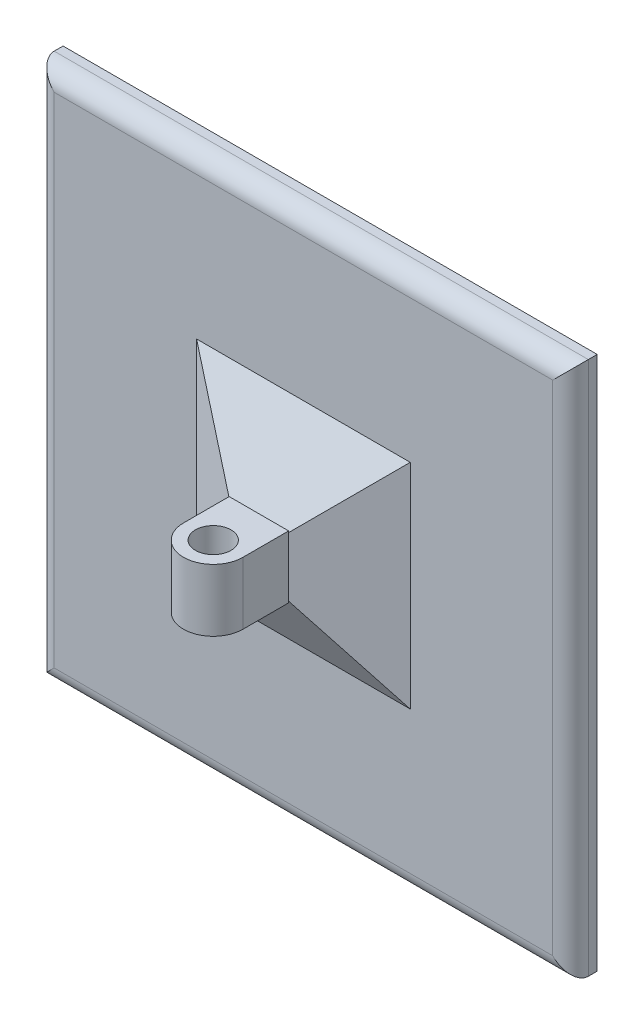
ISO-10303-21;
HEADER;
FILE_DESCRIPTION(('STEP AP214'),'2;1');
FILE_NAME('part.step','',(''),(''),'','','');
FILE_SCHEMA(('AUTOMOTIVE_DESIGN { 1 0 10303 214 1 1 1 1 }'));
ENDSEC;
DATA;
#1=APPLICATION_CONTEXT('core data for automotive mechanical design processes');
#2=APPLICATION_PROTOCOL_DEFINITION('international standard','automotive_design',2000,#1);
#3=PRODUCT_CONTEXT('',#1,'mechanical');
#4=PRODUCT('Part','Part','',(#3));
#5=PRODUCT_RELATED_PRODUCT_CATEGORY('part','',(#4));
#6=PRODUCT_DEFINITION_FORMATION('','',#4);
#7=PRODUCT_DEFINITION_CONTEXT('part definition',#1,'design');
#8=PRODUCT_DEFINITION('design','',#6,#7);
#9=PRODUCT_DEFINITION_SHAPE('','',#8);
#10=(LENGTH_UNIT() NAMED_UNIT(*) SI_UNIT(.MILLI.,.METRE.));
#11=(NAMED_UNIT(*) PLANE_ANGLE_UNIT() SI_UNIT($,.RADIAN.));
#12=(NAMED_UNIT(*) SI_UNIT($,.STERADIAN.) SOLID_ANGLE_UNIT());
#13=UNCERTAINTY_MEASURE_WITH_UNIT(LENGTH_MEASURE(1.E-05),#10,'distance_accuracy_value','');
#14=(GEOMETRIC_REPRESENTATION_CONTEXT(3) GLOBAL_UNCERTAINTY_ASSIGNED_CONTEXT((#13)) GLOBAL_UNIT_ASSIGNED_CONTEXT((#10,
#11,#12)) REPRESENTATION_CONTEXT('',''));
#15=CARTESIAN_POINT('',(0.,0.,0.));
#16=DIRECTION('',(0.,0.,1.));
#17=DIRECTION('',(1.,0.,0.));
#18=AXIS2_PLACEMENT_3D('',#15,#16,#17);
#19=CARTESIAN_POINT('',(0.,0.,3.));
#20=DIRECTION('',(0.,0.,1.));
#21=DIRECTION('',(1.,0.,0.));
#22=AXIS2_PLACEMENT_3D('',#19,#20,#21);
#23=PLANE('',#22);
#24=DIRECTION('',(0.,-1.,0.));
#25=VECTOR('',#24,1.);
#26=CARTESIAN_POINT('',(-28.,-30.,3.));
#27=LINE('',#26,#25);
#28=CARTESIAN_POINT('',(-28.,28.,3.));
#29=VERTEX_POINT('',#28);
#30=CARTESIAN_POINT('',(-28.,-28.,3.));
#31=VERTEX_POINT('',#30);
#32=EDGE_CURVE('E227',#29,#31,#27,.T.);
#33=ORIENTED_EDGE('',*,*,#32,.T.);
#34=DIRECTION('',(1.,0.,0.));
#35=VECTOR('',#34,1.);
#36=CARTESIAN_POINT('',(30.,-28.,3.));
#37=LINE('',#36,#35);
#38=CARTESIAN_POINT('',(28.,-28.,3.));
#39=VERTEX_POINT('',#38);
#40=EDGE_CURVE('E229',#31,#39,#37,.T.);
#41=ORIENTED_EDGE('',*,*,#40,.T.);
#42=DIRECTION('',(0.,1.,0.));
#43=VECTOR('',#42,1.);
#44=CARTESIAN_POINT('',(28.,30.,3.));
#45=LINE('',#44,#43);
#46=CARTESIAN_POINT('',(28.,28.,3.));
#47=VERTEX_POINT('',#46);
#48=EDGE_CURVE('E225',#39,#47,#45,.T.);
#49=ORIENTED_EDGE('',*,*,#48,.T.);
#50=DIRECTION('',(-1.,0.,0.));
#51=VECTOR('',#50,1.);
#52=CARTESIAN_POINT('',(-30.,28.,3.));
#53=LINE('',#52,#51);
#54=EDGE_CURVE('E223',#47,#29,#53,.T.);
#55=ORIENTED_EDGE('',*,*,#54,.T.);
#56=EDGE_LOOP('',(#33,#41,#49,#55));
#57=FACE_BOUND('',#56,.T.);
#58=DIRECTION('',(-1.,0.,0.));
#59=VECTOR('',#58,1.);
#60=CARTESIAN_POINT('',(-12.,12.,3.));
#61=LINE('',#60,#59);
#62=CARTESIAN_POINT('',(12.,12.,3.));
#63=VERTEX_POINT('',#62);
#64=CARTESIAN_POINT('',(-12.,12.,3.));
#65=VERTEX_POINT('',#64);
#66=EDGE_CURVE('E174',#63,#65,#61,.T.);
#67=ORIENTED_EDGE('',*,*,#66,.F.);
#68=DIRECTION('',(0.,1.,0.));
#69=VECTOR('',#68,1.);
#70=CARTESIAN_POINT('',(12.,12.,3.));
#71=LINE('',#70,#69);
#72=CARTESIAN_POINT('',(12.,-12.,3.));
#73=VERTEX_POINT('',#72);
#74=EDGE_CURVE('E170',#73,#63,#71,.T.);
#75=ORIENTED_EDGE('',*,*,#74,.F.);
#76=DIRECTION('',(1.,0.,0.));
#77=VECTOR('',#76,1.);
#78=CARTESIAN_POINT('',(-12.,-12.,3.));
#79=LINE('',#78,#77);
#80=CARTESIAN_POINT('',(-12.,-12.,3.));
#81=VERTEX_POINT('',#80);
#82=EDGE_CURVE('E182',#81,#73,#79,.T.);
#83=ORIENTED_EDGE('',*,*,#82,.F.);
#84=DIRECTION('',(0.,-1.,0.));
#85=VECTOR('',#84,1.);
#86=CARTESIAN_POINT('',(-12.,12.,3.));
#87=LINE('',#86,#85);
#88=EDGE_CURVE('E180',#65,#81,#87,.T.);
#89=ORIENTED_EDGE('',*,*,#88,.F.);
#90=EDGE_LOOP('',(#67,#75,#83,#89));
#91=FACE_BOUND('',#90,.T.);
#92=ADVANCED_FACE('F43',(#57,#91),#23,.T.);
#93=CARTESIAN_POINT('',(30.,30.,3.));
#94=DIRECTION('',(-1.,0.,0.));
#95=DIRECTION('',(0.,-1.,0.));
#96=AXIS2_PLACEMENT_3D('',#93,#94,#95);
#97=PLANE('',#96);
#98=DIRECTION('',(0.,0.,-1.));
#99=VECTOR('',#98,1.);
#100=CARTESIAN_POINT('',(30.,30.,3.));
#101=LINE('',#100,#99);
#102=CARTESIAN_POINT('',(30.,30.,1.));
#103=VERTEX_POINT('',#102);
#104=CARTESIAN_POINT('',(30.,30.,0.));
#105=VERTEX_POINT('',#104);
#106=EDGE_CURVE('E221',#103,#105,#101,.T.);
#107=ORIENTED_EDGE('',*,*,#106,.F.);
#108=DIRECTION('',(0.,1.,0.));
#109=VECTOR('',#108,1.);
#110=CARTESIAN_POINT('',(30.,-30.,1.));
#111=LINE('',#110,#109);
#112=CARTESIAN_POINT('',(30.,-30.,1.));
#113=VERTEX_POINT('',#112);
#114=EDGE_CURVE('E52',#103,#113,#111,.F.);
#115=ORIENTED_EDGE('',*,*,#114,.T.);
#116=DIRECTION('',(0.,0.,-1.));
#117=VECTOR('',#116,1.);
#118=CARTESIAN_POINT('',(30.,-30.,3.));
#119=LINE('',#118,#117);
#120=CARTESIAN_POINT('',(30.,-30.,0.));
#121=VERTEX_POINT('',#120);
#122=EDGE_CURVE('E215',#113,#121,#119,.T.);
#123=ORIENTED_EDGE('',*,*,#122,.T.);
#124=DIRECTION('',(0.,1.,0.));
#125=VECTOR('',#124,1.);
#126=CARTESIAN_POINT('',(30.,30.,0.));
#127=LINE('',#126,#125);
#128=EDGE_CURVE('E203',#121,#105,#127,.T.);
#129=ORIENTED_EDGE('',*,*,#128,.T.);
#130=EDGE_LOOP('',(#107,#115,#123,#129));
#131=FACE_BOUND('',#130,.T.);
#132=ADVANCED_FACE('F259',(#131),#97,.F.);
#133=CARTESIAN_POINT('',(-30.,30.,3.));
#134=DIRECTION('',(0.,-1.,0.));
#135=DIRECTION('',(0.,0.,-1.));
#136=AXIS2_PLACEMENT_3D('',#133,#134,#135);
#137=PLANE('',#136);
#138=DIRECTION('',(0.,0.,-1.));
#139=VECTOR('',#138,1.);
#140=CARTESIAN_POINT('',(-30.,30.,3.));
#141=LINE('',#140,#139);
#142=CARTESIAN_POINT('',(-30.,30.,1.));
#143=VERTEX_POINT('',#142);
#144=CARTESIAN_POINT('',(-30.,30.,0.));
#145=VERTEX_POINT('',#144);
#146=EDGE_CURVE('E219',#143,#145,#141,.T.);
#147=ORIENTED_EDGE('',*,*,#146,.F.);
#148=DIRECTION('',(-1.,0.,0.));
#149=VECTOR('',#148,1.);
#150=CARTESIAN_POINT('',(30.,30.,1.));
#151=LINE('',#150,#149);
#152=EDGE_CURVE('E11',#143,#103,#151,.F.);
#153=ORIENTED_EDGE('',*,*,#152,.T.);
#154=ORIENTED_EDGE('',*,*,#106,.T.);
#155=DIRECTION('',(-1.,0.,0.));
#156=VECTOR('',#155,1.);
#157=CARTESIAN_POINT('',(-30.,30.,0.));
#158=LINE('',#157,#156);
#159=EDGE_CURVE('E206',#105,#145,#158,.T.);
#160=ORIENTED_EDGE('',*,*,#159,.T.);
#161=EDGE_LOOP('',(#147,#153,#154,#160));
#162=FACE_BOUND('',#161,.T.);
#163=ADVANCED_FACE('F363',(#162),#137,.F.);
#164=CARTESIAN_POINT('',(-30.,30.,3.));
#165=DIRECTION('',(1.,0.,0.));
#166=DIRECTION('',(0.,1.,0.));
#167=AXIS2_PLACEMENT_3D('',#164,#165,#166);
#168=PLANE('',#167);
#169=DIRECTION('',(0.,0.,-1.));
#170=VECTOR('',#169,1.);
#171=CARTESIAN_POINT('',(-30.,-30.,3.));
#172=LINE('',#171,#170);
#173=CARTESIAN_POINT('',(-30.,-30.,1.));
#174=VERTEX_POINT('',#173);
#175=CARTESIAN_POINT('',(-30.,-30.,0.));
#176=VERTEX_POINT('',#175);
#177=EDGE_CURVE('E217',#174,#176,#172,.T.);
#178=ORIENTED_EDGE('',*,*,#177,.F.);
#179=DIRECTION('',(0.,-1.,0.));
#180=VECTOR('',#179,1.);
#181=CARTESIAN_POINT('',(-30.,30.,1.));
#182=LINE('',#181,#180);
#183=EDGE_CURVE('E235',#174,#143,#182,.F.);
#184=ORIENTED_EDGE('',*,*,#183,.T.);
#185=ORIENTED_EDGE('',*,*,#146,.T.);
#186=DIRECTION('',(0.,-1.,0.));
#187=VECTOR('',#186,1.);
#188=CARTESIAN_POINT('',(-30.,30.,0.));
#189=LINE('',#188,#187);
#190=EDGE_CURVE('E209',#145,#176,#189,.T.);
#191=ORIENTED_EDGE('',*,*,#190,.T.);
#192=EDGE_LOOP('',(#178,#184,#185,#191));
#193=FACE_BOUND('',#192,.T.);
#194=ADVANCED_FACE('F360',(#193),#168,.F.);
#195=CARTESIAN_POINT('',(-30.,-30.,3.));
#196=DIRECTION('',(0.,1.,0.));
#197=DIRECTION('',(0.,0.,1.));
#198=AXIS2_PLACEMENT_3D('',#195,#196,#197);
#199=PLANE('',#198);
#200=ORIENTED_EDGE('',*,*,#122,.F.);
#201=DIRECTION('',(1.,0.,0.));
#202=VECTOR('',#201,1.);
#203=CARTESIAN_POINT('',(-30.,-30.,1.));
#204=LINE('',#203,#202);
#205=EDGE_CURVE('E232',#113,#174,#204,.F.);
#206=ORIENTED_EDGE('',*,*,#205,.T.);
#207=ORIENTED_EDGE('',*,*,#177,.T.);
#208=DIRECTION('',(1.,0.,0.));
#209=VECTOR('',#208,1.);
#210=CARTESIAN_POINT('',(-30.,-30.,0.));
#211=LINE('',#210,#209);
#212=EDGE_CURVE('E212',#176,#121,#211,.T.);
#213=ORIENTED_EDGE('',*,*,#212,.T.);
#214=EDGE_LOOP('',(#200,#206,#207,#213));
#215=FACE_BOUND('',#214,.T.);
#216=ADVANCED_FACE('F262',(#215),#199,.F.);
#217=CARTESIAN_POINT('',(0.,0.,0.));
#218=DIRECTION('',(0.,0.,1.));
#219=DIRECTION('',(1.,0.,0.));
#220=AXIS2_PLACEMENT_3D('',#217,#218,#219);
#221=PLANE('',#220);
#222=ORIENTED_EDGE('',*,*,#128,.F.);
#223=ORIENTED_EDGE('',*,*,#212,.F.);
#224=ORIENTED_EDGE('',*,*,#190,.F.);
#225=ORIENTED_EDGE('',*,*,#159,.F.);
#226=EDGE_LOOP('',(#222,#223,#224,#225));
#227=FACE_BOUND('',#226,.T.);
#228=ADVANCED_FACE('F354',(#227),#221,.F.);
#229=CARTESIAN_POINT('',(0.,28.,1.));
#230=DIRECTION('',(1.,0.,0.));
#231=DIRECTION('',(0.,0.,-1.));
#232=AXIS2_PLACEMENT_3D('',#229,#230,#231);
#233=CYLINDRICAL_SURFACE('',#232,2.);
#234=CARTESIAN_POINT('',(28.,28.,1.));
#235=DIRECTION('',(0.707106781186548,-0.707106781186547,0.));
#236=DIRECTION('',(0.707106781186547,0.707106781186548,0.));
#237=AXIS2_PLACEMENT_3D('',#234,#235,#236);
#238=ELLIPSE('',#237,2.82842712474619,2.);
#239=EDGE_CURVE('E240',#103,#47,#238,.T.);
#240=ORIENTED_EDGE('',*,*,#239,.F.);
#241=ORIENTED_EDGE('',*,*,#152,.F.);
#242=CARTESIAN_POINT('',(-28.,28.,1.));
#243=DIRECTION('',(0.707106781186547,0.707106781186548,0.));
#244=DIRECTION('',(0.707106781186548,-0.707106781186547,0.));
#245=AXIS2_PLACEMENT_3D('',#242,#243,#244);
#246=ELLIPSE('',#245,2.82842712474619,2.);
#247=EDGE_CURVE('E47',#29,#143,#246,.F.);
#248=ORIENTED_EDGE('',*,*,#247,.F.);
#249=ORIENTED_EDGE('',*,*,#54,.F.);
#250=EDGE_LOOP('',(#240,#241,#248,#249));
#251=FACE_BOUND('',#250,.T.);
#252=ADVANCED_FACE('F45',(#251),#233,.T.);
#253=CARTESIAN_POINT('',(-28.,0.,1.));
#254=DIRECTION('',(0.,1.,0.));
#255=DIRECTION('',(-1.,0.,0.));
#256=AXIS2_PLACEMENT_3D('',#253,#254,#255);
#257=CYLINDRICAL_SURFACE('',#256,2.);
#258=ORIENTED_EDGE('',*,*,#247,.T.);
#259=ORIENTED_EDGE('',*,*,#183,.F.);
#260=CARTESIAN_POINT('',(-28.,-28.,1.));
#261=DIRECTION('',(-0.707106781186548,0.707106781186547,0.));
#262=DIRECTION('',(0.707106781186547,0.707106781186548,0.));
#263=AXIS2_PLACEMENT_3D('',#260,#261,#262);
#264=ELLIPSE('',#263,2.82842712474619,2.);
#265=EDGE_CURVE('E239',#31,#174,#264,.F.);
#266=ORIENTED_EDGE('',*,*,#265,.F.);
#267=ORIENTED_EDGE('',*,*,#32,.F.);
#268=EDGE_LOOP('',(#258,#259,#266,#267));
#269=FACE_BOUND('',#268,.T.);
#270=ADVANCED_FACE('F251',(#269),#257,.T.);
#271=CARTESIAN_POINT('',(28.,0.,1.));
#272=DIRECTION('',(0.,-1.,0.));
#273=DIRECTION('',(1.,0.,0.));
#274=AXIS2_PLACEMENT_3D('',#271,#272,#273);
#275=CYLINDRICAL_SURFACE('',#274,2.);
#276=ORIENTED_EDGE('',*,*,#239,.T.);
#277=ORIENTED_EDGE('',*,*,#48,.F.);
#278=CARTESIAN_POINT('',(28.,-28.,1.));
#279=DIRECTION('',(-0.707106781186547,-0.707106781186548,0.));
#280=DIRECTION('',(0.707106781186548,-0.707106781186547,0.));
#281=AXIS2_PLACEMENT_3D('',#278,#279,#280);
#282=ELLIPSE('',#281,2.82842712474619,2.);
#283=EDGE_CURVE('E187',#113,#39,#282,.T.);
#284=ORIENTED_EDGE('',*,*,#283,.F.);
#285=ORIENTED_EDGE('',*,*,#114,.F.);
#286=EDGE_LOOP('',(#276,#277,#284,#285));
#287=FACE_BOUND('',#286,.T.);
#288=ADVANCED_FACE('F256',(#287),#275,.T.);
#289=CARTESIAN_POINT('',(0.,-28.,1.));
#290=DIRECTION('',(-1.,0.,0.));
#291=DIRECTION('',(0.,0.,1.));
#292=AXIS2_PLACEMENT_3D('',#289,#290,#291);
#293=CYLINDRICAL_SURFACE('',#292,2.);
#294=ORIENTED_EDGE('',*,*,#265,.T.);
#295=ORIENTED_EDGE('',*,*,#205,.F.);
#296=ORIENTED_EDGE('',*,*,#283,.T.);
#297=ORIENTED_EDGE('',*,*,#40,.F.);
#298=EDGE_LOOP('',(#294,#295,#296,#297));
#299=FACE_BOUND('',#298,.T.);
#300=ADVANCED_FACE('F267',(#299),#293,.T.);
#301=CARTESIAN_POINT('',(12.,12.,3.));
#302=DIRECTION('',(0.499999999999998,0.,0.86602540378444));
#303=DIRECTION('',(0.86602540378444,0.,-0.499999999999998));
#304=AXIS2_PLACEMENT_3D('',#301,#302,#303);
#305=PLANE('',#304);
#306=ORIENTED_EDGE('',*,*,#74,.T.);
#307=DIRECTION('',(0.654653670707977,0.654653670707978,-0.377964473009226));
#308=VECTOR('',#307,1.);
#309=CARTESIAN_POINT('',(1.7142857142857,1.7142857142857,8.9384599116647));
#310=LINE('',#309,#308);
#311=CARTESIAN_POINT('',(3.33974596215557,3.33974596215556,8.));
#312=VERTEX_POINT('',#311);
#313=EDGE_CURVE('E185',#312,#63,#310,.T.);
#314=ORIENTED_EDGE('',*,*,#313,.F.);
#315=DIRECTION('',(0.,-1.,0.));
#316=VECTOR('',#315,1.);
#317=CARTESIAN_POINT('',(3.33974596215557,12.,8.));
#318=LINE('',#317,#316);
#319=CARTESIAN_POINT('',(3.33974596215557,-3.33974596215557,8.));
#320=VERTEX_POINT('',#319);
#321=EDGE_CURVE('E184',#320,#312,#318,.F.);
#322=ORIENTED_EDGE('',*,*,#321,.F.);
#323=DIRECTION('',(0.654653670707978,-0.654653670707978,-0.377964473009225));
#324=VECTOR('',#323,1.);
#325=CARTESIAN_POINT('',(1.7142857142857,-1.7142857142857,8.9384599116647));
#326=LINE('',#325,#324);
#327=EDGE_CURVE('E189',#320,#73,#326,.T.);
#328=ORIENTED_EDGE('',*,*,#327,.T.);
#329=EDGE_LOOP('',(#306,#314,#322,#328));
#330=FACE_BOUND('',#329,.T.);
#331=ADVANCED_FACE('F344',(#330),#305,.T.);
#332=CARTESIAN_POINT('',(-12.,12.,3.));
#333=DIRECTION('',(0.,0.499999999999998,0.86602540378444));
#334=DIRECTION('',(0.,-0.86602540378444,0.499999999999998));
#335=AXIS2_PLACEMENT_3D('',#332,#333,#334);
#336=PLANE('',#335);
#337=ORIENTED_EDGE('',*,*,#66,.T.);
#338=DIRECTION('',(-0.654653670707978,0.654653670707978,-0.377964473009225));
#339=VECTOR('',#338,1.);
#340=CARTESIAN_POINT('',(-12.,12.,3.));
#341=LINE('',#340,#339);
#342=CARTESIAN_POINT('',(-3.33974596215557,3.33974596215556,8.));
#343=VERTEX_POINT('',#342);
#344=EDGE_CURVE('E188',#343,#65,#341,.T.);
#345=ORIENTED_EDGE('',*,*,#344,.F.);
#346=DIRECTION('',(1.,0.,0.));
#347=VECTOR('',#346,1.);
#348=CARTESIAN_POINT('',(-12.,3.33974596215556,8.));
#349=LINE('',#348,#347);
#350=EDGE_CURVE('E169',#312,#343,#349,.F.);
#351=ORIENTED_EDGE('',*,*,#350,.F.);
#352=ORIENTED_EDGE('',*,*,#313,.T.);
#353=EDGE_LOOP('',(#337,#345,#351,#352));
#354=FACE_BOUND('',#353,.T.);
#355=ADVANCED_FACE('F278',(#354),#336,.T.);
#356=CARTESIAN_POINT('',(-12.,12.,3.));
#357=DIRECTION('',(-0.499999999999998,0.,0.86602540378444));
#358=DIRECTION('',(0.86602540378444,0.,0.499999999999998));
#359=AXIS2_PLACEMENT_3D('',#356,#357,#358);
#360=PLANE('',#359);
#361=ORIENTED_EDGE('',*,*,#88,.T.);
#362=DIRECTION('',(-0.654653670707978,-0.654653670707978,-0.377964473009226));
#363=VECTOR('',#362,1.);
#364=CARTESIAN_POINT('',(-12.,-12.,3.));
#365=LINE('',#364,#363);
#366=CARTESIAN_POINT('',(-3.33974596215557,-3.33974596215557,8.));
#367=VERTEX_POINT('',#366);
#368=EDGE_CURVE('E60',#367,#81,#365,.T.);
#369=ORIENTED_EDGE('',*,*,#368,.F.);
#370=DIRECTION('',(0.,1.,0.));
#371=VECTOR('',#370,1.);
#372=CARTESIAN_POINT('',(-3.33974596215557,12.,8.));
#373=LINE('',#372,#371);
#374=EDGE_CURVE('E199',#343,#367,#373,.F.);
#375=ORIENTED_EDGE('',*,*,#374,.F.);
#376=ORIENTED_EDGE('',*,*,#344,.T.);
#377=EDGE_LOOP('',(#361,#369,#375,#376));
#378=FACE_BOUND('',#377,.T.);
#379=ADVANCED_FACE('F282',(#378),#360,.T.);
#380=CARTESIAN_POINT('',(-12.,-12.,3.));
#381=DIRECTION('',(0.,-0.499999999999998,0.86602540378444));
#382=DIRECTION('',(0.,-0.86602540378444,-0.499999999999998));
#383=AXIS2_PLACEMENT_3D('',#380,#381,#382);
#384=PLANE('',#383);
#385=ORIENTED_EDGE('',*,*,#82,.T.);
#386=ORIENTED_EDGE('',*,*,#327,.F.);
#387=DIRECTION('',(-1.,0.,0.));
#388=VECTOR('',#387,1.);
#389=CARTESIAN_POINT('',(-12.,-3.33974596215557,8.));
#390=LINE('',#389,#388);
#391=EDGE_CURVE('E192',#367,#320,#390,.F.);
#392=ORIENTED_EDGE('',*,*,#391,.F.);
#393=ORIENTED_EDGE('',*,*,#368,.T.);
#394=EDGE_LOOP('',(#385,#386,#392,#393));
#395=FACE_BOUND('',#394,.T.);
#396=ADVANCED_FACE('F343',(#395),#384,.T.);
#397=CARTESIAN_POINT('',(-3.33974596215557,3.5,8.));
#398=DIRECTION('',(0.,0.,1.));
#399=DIRECTION('',(1.,0.,0.));
#400=AXIS2_PLACEMENT_3D('',#397,#398,#399);
#401=PLANE('',#400);
#402=DIRECTION('',(0.,-1.,0.));
#403=VECTOR('',#402,1.);
#404=CARTESIAN_POINT('',(3.33974596215557,3.5,8.));
#405=LINE('',#404,#403);
#406=CARTESIAN_POINT('',(3.33974596215557,3.5,8.));
#407=VERTEX_POINT('',#406);
#408=EDGE_CURVE('E310',#407,#312,#405,.T.);
#409=ORIENTED_EDGE('',*,*,#408,.T.);
#410=ORIENTED_EDGE('',*,*,#350,.T.);
#411=DIRECTION('',(0.,-1.,0.));
#412=VECTOR('',#411,1.);
#413=CARTESIAN_POINT('',(-3.33974596215557,3.5,8.));
#414=LINE('',#413,#412);
#415=CARTESIAN_POINT('',(-3.33974596215557,3.5,8.));
#416=VERTEX_POINT('',#415);
#417=EDGE_CURVE('E150',#416,#343,#414,.T.);
#418=ORIENTED_EDGE('',*,*,#417,.F.);
#419=DIRECTION('',(-1.,0.,0.));
#420=VECTOR('',#419,1.);
#421=CARTESIAN_POINT('',(-3.33974596215557,3.5,8.));
#422=LINE('',#421,#420);
#423=EDGE_CURVE('E156',#407,#416,#422,.T.);
#424=ORIENTED_EDGE('',*,*,#423,.F.);
#425=EDGE_LOOP('',(#409,#410,#418,#424));
#426=FACE_BOUND('',#425,.T.);
#427=ADVANCED_FACE('F168',(#426),#401,.F.);
#428=CARTESIAN_POINT('',(-3.33974596215557,-3.5,8.));
#429=VERTEX_POINT('',#428);
#430=EDGE_CURVE('E171',#367,#429,#414,.T.);
#431=ORIENTED_EDGE('',*,*,#430,.F.);
#432=ORIENTED_EDGE('',*,*,#391,.T.);
#433=CARTESIAN_POINT('',(3.33974596215557,-3.5,8.));
#434=VERTEX_POINT('',#433);
#435=EDGE_CURVE('E298',#320,#434,#405,.T.);
#436=ORIENTED_EDGE('',*,*,#435,.T.);
#437=DIRECTION('',(-1.,0.,0.));
#438=VECTOR('',#437,1.);
#439=CARTESIAN_POINT('',(-3.33974596215557,-3.5,8.));
#440=LINE('',#439,#438);
#441=EDGE_CURVE('E293',#434,#429,#440,.T.);
#442=ORIENTED_EDGE('',*,*,#441,.T.);
#443=EDGE_LOOP('',(#431,#432,#436,#442));
#444=FACE_BOUND('',#443,.T.);
#445=ADVANCED_FACE('F296',(#444),#401,.F.);
#446=CARTESIAN_POINT('',(-3.33974596215557,3.5,8.));
#447=DIRECTION('',(1.,0.,0.));
#448=DIRECTION('',(0.,0.,-1.));
#449=AXIS2_PLACEMENT_3D('',#446,#447,#448);
#450=PLANE('',#449);
#451=DIRECTION('',(0.,0.,1.));
#452=VECTOR('',#451,1.);
#453=CARTESIAN_POINT('',(-3.33974596215557,-3.5,8.));
#454=LINE('',#453,#452);
#455=CARTESIAN_POINT('',(-3.33974596215556,-3.5,13.130693005105));
#456=VERTEX_POINT('',#455);
#457=EDGE_CURVE('E285',#429,#456,#454,.T.);
#458=ORIENTED_EDGE('',*,*,#457,.T.);
#459=DIRECTION('',(0.,-1.,0.));
#460=VECTOR('',#459,1.);
#461=CARTESIAN_POINT('',(-3.33974596215556,3.5,13.130693005105));
#462=LINE('',#461,#460);
#463=CARTESIAN_POINT('',(-3.33974596215556,3.5,13.130693005105));
#464=VERTEX_POINT('',#463);
#465=EDGE_CURVE('E152',#464,#456,#462,.T.);
#466=ORIENTED_EDGE('',*,*,#465,.F.);
#467=DIRECTION('',(0.,0.,1.));
#468=VECTOR('',#467,1.);
#469=CARTESIAN_POINT('',(-3.33974596215557,3.5,8.));
#470=LINE('',#469,#468);
#471=EDGE_CURVE('E145',#416,#464,#470,.T.);
#472=ORIENTED_EDGE('',*,*,#471,.F.);
#473=ORIENTED_EDGE('',*,*,#417,.T.);
#474=ORIENTED_EDGE('',*,*,#374,.T.);
#475=ORIENTED_EDGE('',*,*,#430,.T.);
#476=EDGE_LOOP('',(#458,#466,#472,#473,#474,#475));
#477=FACE_BOUND('',#476,.T.);
#478=ADVANCED_FACE('F147',(#477),#450,.F.);
#479=CARTESIAN_POINT('',(0.,3.5,13.130693005105));
#480=DIRECTION('',(0.,-1.,0.));
#481=DIRECTION('',(0.,0.,-1.));
#482=AXIS2_PLACEMENT_3D('',#479,#480,#481);
#483=CYLINDRICAL_SURFACE('',#482,3.33974596215557);
#484=CARTESIAN_POINT('',(0.,-3.5,13.130693005105));
#485=DIRECTION('',(0.,1.,0.));
#486=DIRECTION('',(0.,0.,1.));
#487=AXIS2_PLACEMENT_3D('',#484,#485,#486);
#488=CIRCLE('',#487,3.33974596215557);
#489=CARTESIAN_POINT('',(3.33974596215557,-3.5,13.130693005105));
#490=VERTEX_POINT('',#489);
#491=EDGE_CURVE('E294',#456,#490,#488,.T.);
#492=ORIENTED_EDGE('',*,*,#491,.T.);
#493=DIRECTION('',(0.,-1.,0.));
#494=VECTOR('',#493,1.);
#495=CARTESIAN_POINT('',(3.33974596215557,3.5,13.130693005105));
#496=LINE('',#495,#494);
#497=CARTESIAN_POINT('',(3.33974596215557,3.5,13.130693005105));
#498=VERTEX_POINT('',#497);
#499=EDGE_CURVE('E311',#498,#490,#496,.T.);
#500=ORIENTED_EDGE('',*,*,#499,.F.);
#501=CARTESIAN_POINT('',(0.,3.5,13.130693005105));
#502=DIRECTION('',(0.,1.,0.));
#503=DIRECTION('',(0.,0.,1.));
#504=AXIS2_PLACEMENT_3D('',#501,#502,#503);
#505=CIRCLE('',#504,3.33974596215557);
#506=EDGE_CURVE('E155',#464,#498,#505,.T.);
#507=ORIENTED_EDGE('',*,*,#506,.F.);
#508=ORIENTED_EDGE('',*,*,#465,.T.);
#509=EDGE_LOOP('',(#492,#500,#507,#508));
#510=FACE_BOUND('',#509,.T.);
#511=ADVANCED_FACE('F316',(#510),#483,.T.);
#512=CARTESIAN_POINT('',(3.33974596215557,3.5,13.130693005105));
#513=DIRECTION('',(-1.,0.,0.));
#514=DIRECTION('',(0.,0.,1.));
#515=AXIS2_PLACEMENT_3D('',#512,#513,#514);
#516=PLANE('',#515);
#517=DIRECTION('',(0.,0.,-1.));
#518=VECTOR('',#517,1.);
#519=CARTESIAN_POINT('',(3.33974596215557,-3.5,13.130693005105));
#520=LINE('',#519,#518);
#521=EDGE_CURVE('E165',#490,#434,#520,.T.);
#522=ORIENTED_EDGE('',*,*,#521,.T.);
#523=ORIENTED_EDGE('',*,*,#435,.F.);
#524=ORIENTED_EDGE('',*,*,#321,.T.);
#525=ORIENTED_EDGE('',*,*,#408,.F.);
#526=DIRECTION('',(0.,0.,-1.));
#527=VECTOR('',#526,1.);
#528=CARTESIAN_POINT('',(3.33974596215557,3.5,13.130693005105));
#529=LINE('',#528,#527);
#530=EDGE_CURVE('E161',#498,#407,#529,.T.);
#531=ORIENTED_EDGE('',*,*,#530,.F.);
#532=ORIENTED_EDGE('',*,*,#499,.T.);
#533=EDGE_LOOP('',(#522,#523,#524,#525,#531,#532));
#534=FACE_BOUND('',#533,.T.);
#535=ADVANCED_FACE('F331',(#534),#516,.F.);
#536=CARTESIAN_POINT('',(0.,3.5,13.130693005105));
#537=DIRECTION('',(0.,1.,0.));
#538=DIRECTION('',(0.,0.,1.));
#539=AXIS2_PLACEMENT_3D('',#536,#537,#538);
#540=PLANE('',#539);
#541=CARTESIAN_POINT('',(0.,3.5,13.130693005105));
#542=DIRECTION('',(0.,-1.,0.));
#543=DIRECTION('',(0.,0.,-1.));
#544=AXIS2_PLACEMENT_3D('',#541,#542,#543);
#545=CIRCLE('',#544,2.);
#546=CARTESIAN_POINT('',(0.,3.5,11.130693005105));
#547=VERTEX_POINT('',#546);
#548=EDGE_CURVE('E300',#547,#547,#545,.T.);
#549=ORIENTED_EDGE('',*,*,#548,.T.);
#550=EDGE_LOOP('',(#549));
#551=FACE_BOUND('',#550,.T.);
#552=ORIENTED_EDGE('',*,*,#423,.T.);
#553=ORIENTED_EDGE('',*,*,#471,.T.);
#554=ORIENTED_EDGE('',*,*,#506,.T.);
#555=ORIENTED_EDGE('',*,*,#530,.T.);
#556=EDGE_LOOP('',(#552,#553,#554,#555));
#557=FACE_BOUND('',#556,.T.);
#558=ADVANCED_FACE('F159',(#551,#557),#540,.T.);
#559=CARTESIAN_POINT('',(0.,-3.5,13.130693005105));
#560=DIRECTION('',(0.,1.,0.));
#561=DIRECTION('',(0.,0.,1.));
#562=AXIS2_PLACEMENT_3D('',#559,#560,#561);
#563=PLANE('',#562);
#564=CARTESIAN_POINT('',(0.,-3.5,13.130693005105));
#565=DIRECTION('',(0.,-1.,0.));
#566=DIRECTION('',(0.,0.,-1.));
#567=AXIS2_PLACEMENT_3D('',#564,#565,#566);
#568=CIRCLE('',#567,2.);
#569=CARTESIAN_POINT('',(0.,-3.5,11.130693005105));
#570=VERTEX_POINT('',#569);
#571=EDGE_CURVE('E303',#570,#570,#568,.T.);
#572=ORIENTED_EDGE('',*,*,#571,.F.);
#573=EDGE_LOOP('',(#572));
#574=FACE_BOUND('',#573,.T.);
#575=ORIENTED_EDGE('',*,*,#441,.F.);
#576=ORIENTED_EDGE('',*,*,#521,.F.);
#577=ORIENTED_EDGE('',*,*,#491,.F.);
#578=ORIENTED_EDGE('',*,*,#457,.F.);
#579=EDGE_LOOP('',(#575,#576,#577,#578));
#580=FACE_BOUND('',#579,.T.);
#581=ADVANCED_FACE('F291',(#574,#580),#563,.F.);
#582=CARTESIAN_POINT('',(0.,3.5,13.130693005105));
#583=DIRECTION('',(0.,-1.,0.));
#584=DIRECTION('',(0.,0.,-1.));
#585=AXIS2_PLACEMENT_3D('',#582,#583,#584);
#586=CYLINDRICAL_SURFACE('',#585,2.);
#587=ORIENTED_EDGE('',*,*,#548,.F.);
#588=EDGE_LOOP('',(#587));
#589=FACE_BOUND('',#588,.T.);
#590=ORIENTED_EDGE('',*,*,#571,.T.);
#591=EDGE_LOOP('',(#590));
#592=FACE_BOUND('',#591,.T.);
#593=ADVANCED_FACE('F321',(#589,#592),#586,.F.);
#594=CLOSED_SHELL('',(#92,#132,#163,#194,#216,#228,#252,#270,#288,#300,#331,#355,#379,#396,#427,
#445,#478,#511,#535,#558,#581,#593));
#595=MANIFOLD_SOLID_BREP('B2',#594);
#596=ADVANCED_BREP_SHAPE_REPRESENTATION('',(#18,#595),#14);
#597=SHAPE_DEFINITION_REPRESENTATION(#9,#596);
ENDSEC;
END-ISO-10303-21;
